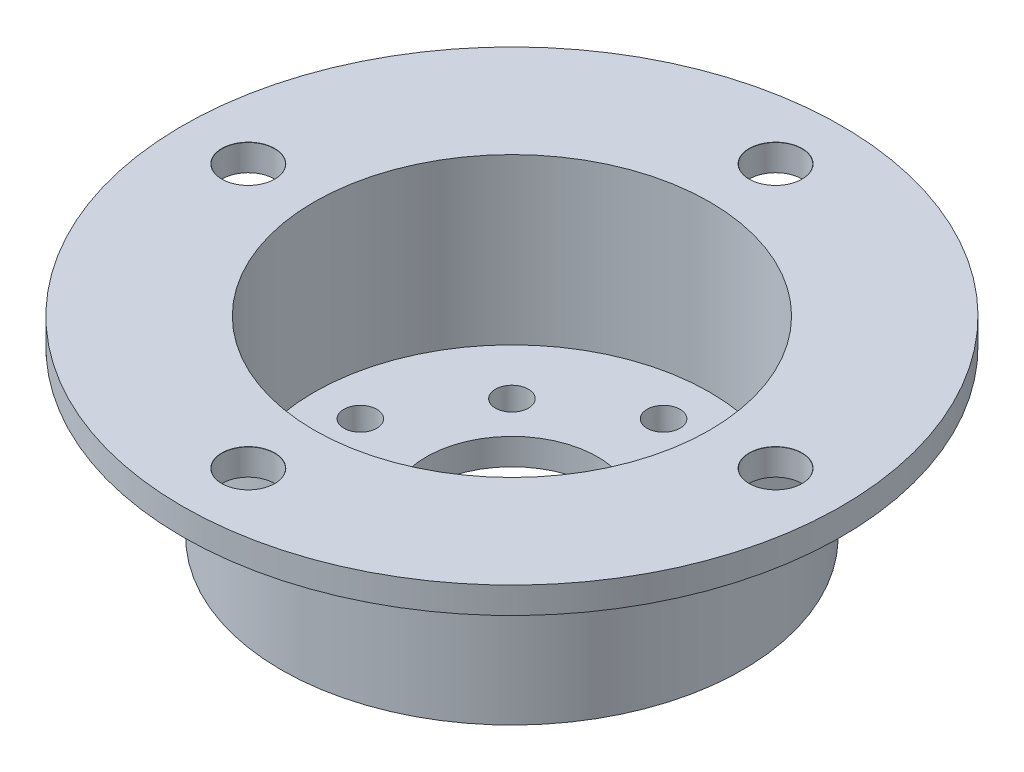
ISO-10303-21;
HEADER;
FILE_DESCRIPTION(('STEP AP214'),'2;1');
FILE_NAME('part.step','',(''),(''),'','','');
FILE_SCHEMA(('AUTOMOTIVE_DESIGN { 1 0 10303 214 1 1 1 1 }'));
ENDSEC;
DATA;
#1=APPLICATION_CONTEXT('core data for automotive mechanical design processes');
#2=APPLICATION_PROTOCOL_DEFINITION('international standard','automotive_design',2000,#1);
#3=PRODUCT_CONTEXT('',#1,'mechanical');
#4=PRODUCT('Part','Part','',(#3));
#5=PRODUCT_RELATED_PRODUCT_CATEGORY('part','',(#4));
#6=PRODUCT_DEFINITION_FORMATION('','',#4);
#7=PRODUCT_DEFINITION_CONTEXT('part definition',#1,'design');
#8=PRODUCT_DEFINITION('design','',#6,#7);
#9=PRODUCT_DEFINITION_SHAPE('','',#8);
#10=(LENGTH_UNIT() NAMED_UNIT(*) SI_UNIT(.MILLI.,.METRE.));
#11=(NAMED_UNIT(*) PLANE_ANGLE_UNIT() SI_UNIT($,.RADIAN.));
#12=(NAMED_UNIT(*) SI_UNIT($,.STERADIAN.) SOLID_ANGLE_UNIT());
#13=UNCERTAINTY_MEASURE_WITH_UNIT(LENGTH_MEASURE(1.E-05),#10,'distance_accuracy_value','');
#14=(GEOMETRIC_REPRESENTATION_CONTEXT(3) GLOBAL_UNCERTAINTY_ASSIGNED_CONTEXT((#13)) GLOBAL_UNIT_ASSIGNED_CONTEXT((#10,
#11,#12)) REPRESENTATION_CONTEXT('',''));
#15=CARTESIAN_POINT('',(0.,0.,0.));
#16=DIRECTION('',(0.,0.,1.));
#17=DIRECTION('',(1.,0.,0.));
#18=AXIS2_PLACEMENT_3D('',#15,#16,#17);
#19=CARTESIAN_POINT('',(0.,0.,0.));
#20=DIRECTION('',(0.,1.,0.));
#21=DIRECTION('',(0.,0.,1.));
#22=AXIS2_PLACEMENT_3D('',#19,#20,#21);
#23=PLANE('',#22);
#24=CARTESIAN_POINT('',(0.,0.,0.));
#25=DIRECTION('',(0.,1.,0.));
#26=DIRECTION('',(0.,0.,1.));
#27=AXIS2_PLACEMENT_3D('',#24,#25,#26);
#28=CIRCLE('',#27,13.);
#29=CARTESIAN_POINT('',(0.,0.,13.));
#30=VERTEX_POINT('',#29);
#31=EDGE_CURVE('E152',#30,#30,#28,.T.);
#32=ORIENTED_EDGE('',*,*,#31,.F.);
#33=EDGE_LOOP('',(#32));
#34=FACE_BOUND('',#33,.T.);
#35=CARTESIAN_POINT('',(-23.,0.,0.));
#36=DIRECTION('',(0.,1.,0.));
#37=DIRECTION('',(0.,0.,1.));
#38=AXIS2_PLACEMENT_3D('',#35,#36,#37);
#39=CIRCLE('',#38,2.5);
#40=CARTESIAN_POINT('',(-23.,0.,2.5));
#41=VERTEX_POINT('',#40);
#42=EDGE_CURVE('E149',#41,#41,#39,.T.);
#43=ORIENTED_EDGE('',*,*,#42,.F.);
#44=EDGE_LOOP('',(#43));
#45=FACE_BOUND('',#44,.T.);
#46=CARTESIAN_POINT('',(0.,0.,23.));
#47=DIRECTION('',(0.,1.,0.));
#48=DIRECTION('',(0.,0.,1.));
#49=AXIS2_PLACEMENT_3D('',#46,#47,#48);
#50=CIRCLE('',#49,2.5);
#51=CARTESIAN_POINT('',(0.,0.,25.5));
#52=VERTEX_POINT('',#51);
#53=EDGE_CURVE('E142',#52,#52,#50,.T.);
#54=ORIENTED_EDGE('',*,*,#53,.F.);
#55=EDGE_LOOP('',(#54));
#56=FACE_BOUND('',#55,.T.);
#57=CARTESIAN_POINT('',(0.,0.,-23.));
#58=DIRECTION('',(0.,1.,0.));
#59=DIRECTION('',(0.,0.,1.));
#60=AXIS2_PLACEMENT_3D('',#57,#58,#59);
#61=CIRCLE('',#60,2.5);
#62=CARTESIAN_POINT('',(0.,0.,-20.5));
#63=VERTEX_POINT('',#62);
#64=EDGE_CURVE('E135',#63,#63,#61,.T.);
#65=ORIENTED_EDGE('',*,*,#64,.F.);
#66=EDGE_LOOP('',(#65));
#67=FACE_BOUND('',#66,.T.);
#68=CARTESIAN_POINT('',(23.,0.,0.));
#69=DIRECTION('',(0.,1.,0.));
#70=DIRECTION('',(0.,0.,1.));
#71=AXIS2_PLACEMENT_3D('',#68,#69,#70);
#72=CIRCLE('',#71,2.5);
#73=CARTESIAN_POINT('',(23.,0.,2.5));
#74=VERTEX_POINT('',#73);
#75=EDGE_CURVE('E128',#74,#74,#72,.T.);
#76=ORIENTED_EDGE('',*,*,#75,.F.);
#77=EDGE_LOOP('',(#76));
#78=FACE_BOUND('',#77,.T.);
#79=CARTESIAN_POINT('',(14.142135623731,0.,14.1421356237309));
#80=DIRECTION('',(0.,1.,0.));
#81=DIRECTION('',(0.,0.,1.));
#82=AXIS2_PLACEMENT_3D('',#79,#80,#81);
#83=CIRCLE('',#82,2.49999999999999);
#84=CARTESIAN_POINT('',(14.142135623731,0.,16.6421356237309));
#85=VERTEX_POINT('',#84);
#86=EDGE_CURVE('E121',#85,#85,#83,.T.);
#87=ORIENTED_EDGE('',*,*,#86,.F.);
#88=EDGE_LOOP('',(#87));
#89=FACE_BOUND('',#88,.T.);
#90=CARTESIAN_POINT('',(-14.142135623731,0.,14.1421356237309));
#91=DIRECTION('',(0.,1.,0.));
#92=DIRECTION('',(0.,0.,1.));
#93=AXIS2_PLACEMENT_3D('',#90,#91,#92);
#94=CIRCLE('',#93,2.49999999999999);
#95=CARTESIAN_POINT('',(-14.142135623731,0.,16.6421356237309));
#96=VERTEX_POINT('',#95);
#97=EDGE_CURVE('E114',#96,#96,#94,.T.);
#98=ORIENTED_EDGE('',*,*,#97,.F.);
#99=EDGE_LOOP('',(#98));
#100=FACE_BOUND('',#99,.T.);
#101=CARTESIAN_POINT('',(14.142135623731,0.,-14.1421356237309));
#102=DIRECTION('',(0.,1.,0.));
#103=DIRECTION('',(0.,0.,1.));
#104=AXIS2_PLACEMENT_3D('',#101,#102,#103);
#105=CIRCLE('',#104,2.49999999999999);
#106=CARTESIAN_POINT('',(14.142135623731,0.,-11.6421356237309));
#107=VERTEX_POINT('',#106);
#108=EDGE_CURVE('E107',#107,#107,#105,.T.);
#109=ORIENTED_EDGE('',*,*,#108,.F.);
#110=EDGE_LOOP('',(#109));
#111=FACE_BOUND('',#110,.T.);
#112=CARTESIAN_POINT('',(-14.142135623731,0.,-14.1421356237309));
#113=DIRECTION('',(0.,1.,0.));
#114=DIRECTION('',(0.,0.,1.));
#115=AXIS2_PLACEMENT_3D('',#112,#113,#114);
#116=CIRCLE('',#115,2.49999999999999);
#117=CARTESIAN_POINT('',(-14.142135623731,0.,-11.6421356237309));
#118=VERTEX_POINT('',#117);
#119=EDGE_CURVE('E50',#118,#118,#116,.T.);
#120=ORIENTED_EDGE('',*,*,#119,.F.);
#121=EDGE_LOOP('',(#120));
#122=FACE_BOUND('',#121,.T.);
#123=CARTESIAN_POINT('',(0.,0.,0.));
#124=DIRECTION('',(0.,1.,0.));
#125=DIRECTION('',(0.,0.,1.));
#126=AXIS2_PLACEMENT_3D('',#123,#124,#125);
#127=CIRCLE('',#126,30.);
#128=CARTESIAN_POINT('',(0.,0.,-30.));
#129=VERTEX_POINT('',#128);
#130=EDGE_CURVE('E10',#129,#129,#127,.F.);
#131=ORIENTED_EDGE('',*,*,#130,.F.);
#132=EDGE_LOOP('',(#131));
#133=FACE_BOUND('',#132,.T.);
#134=ADVANCED_FACE('F33',(#34,#45,#56,#67,#78,#89,#100,#111,#122,#133),#23,.T.);
#135=CARTESIAN_POINT('',(0.,-4.,0.));
#136=DIRECTION('',(0.,1.,0.));
#137=DIRECTION('',(0.,0.,1.));
#138=AXIS2_PLACEMENT_3D('',#135,#136,#137);
#139=PLANE('',#138);
#140=CARTESIAN_POINT('',(14.142135623731,-4.,-14.1421356237309));
#141=DIRECTION('',(0.,-1.,0.));
#142=DIRECTION('',(0.,0.,-1.));
#143=AXIS2_PLACEMENT_3D('',#140,#141,#142);
#144=CIRCLE('',#143,2.525);
#145=CARTESIAN_POINT('',(14.142135623731,-4.,-16.6671356237309));
#146=VERTEX_POINT('',#145);
#147=EDGE_CURVE('E101',#146,#146,#144,.T.);
#148=ORIENTED_EDGE('',*,*,#147,.F.);
#149=EDGE_LOOP('',(#148));
#150=FACE_BOUND('',#149,.T.);
#151=CARTESIAN_POINT('',(-14.142135623731,-4.,14.1421356237309));
#152=DIRECTION('',(0.,-1.,0.));
#153=DIRECTION('',(0.,0.,-1.));
#154=AXIS2_PLACEMENT_3D('',#151,#152,#153);
#155=CIRCLE('',#154,2.525);
#156=CARTESIAN_POINT('',(-14.142135623731,-4.,11.6171356237309));
#157=VERTEX_POINT('',#156);
#158=EDGE_CURVE('E108',#157,#157,#155,.T.);
#159=ORIENTED_EDGE('',*,*,#158,.F.);
#160=EDGE_LOOP('',(#159));
#161=FACE_BOUND('',#160,.T.);
#162=CARTESIAN_POINT('',(14.142135623731,-4.,14.1421356237309));
#163=DIRECTION('',(0.,-1.,0.));
#164=DIRECTION('',(0.,0.,-1.));
#165=AXIS2_PLACEMENT_3D('',#162,#163,#164);
#166=CIRCLE('',#165,2.525);
#167=CARTESIAN_POINT('',(14.142135623731,-4.,11.6171356237309));
#168=VERTEX_POINT('',#167);
#169=EDGE_CURVE('E115',#168,#168,#166,.T.);
#170=ORIENTED_EDGE('',*,*,#169,.F.);
#171=EDGE_LOOP('',(#170));
#172=FACE_BOUND('',#171,.T.);
#173=CARTESIAN_POINT('',(23.,-4.,0.));
#174=DIRECTION('',(0.,-1.,0.));
#175=DIRECTION('',(0.,0.,-1.));
#176=AXIS2_PLACEMENT_3D('',#173,#174,#175);
#177=CIRCLE('',#176,2.525);
#178=CARTESIAN_POINT('',(23.,-4.,-2.525));
#179=VERTEX_POINT('',#178);
#180=EDGE_CURVE('E122',#179,#179,#177,.T.);
#181=ORIENTED_EDGE('',*,*,#180,.F.);
#182=EDGE_LOOP('',(#181));
#183=FACE_BOUND('',#182,.T.);
#184=CARTESIAN_POINT('',(0.,-4.,23.));
#185=DIRECTION('',(0.,-1.,0.));
#186=DIRECTION('',(0.,0.,-1.));
#187=AXIS2_PLACEMENT_3D('',#184,#185,#186);
#188=CIRCLE('',#187,2.525);
#189=CARTESIAN_POINT('',(0.,-4.,20.475));
#190=VERTEX_POINT('',#189);
#191=EDGE_CURVE('E136',#190,#190,#188,.T.);
#192=ORIENTED_EDGE('',*,*,#191,.F.);
#193=EDGE_LOOP('',(#192));
#194=FACE_BOUND('',#193,.T.);
#195=CARTESIAN_POINT('',(-23.,-4.,0.));
#196=DIRECTION('',(0.,-1.,0.));
#197=DIRECTION('',(0.,0.,-1.));
#198=AXIS2_PLACEMENT_3D('',#195,#196,#197);
#199=CIRCLE('',#198,2.525);
#200=CARTESIAN_POINT('',(-23.,-4.,-2.525));
#201=VERTEX_POINT('',#200);
#202=EDGE_CURVE('E143',#201,#201,#199,.T.);
#203=ORIENTED_EDGE('',*,*,#202,.F.);
#204=EDGE_LOOP('',(#203));
#205=FACE_BOUND('',#204,.T.);
#206=CARTESIAN_POINT('',(0.,-4.,0.));
#207=DIRECTION('',(0.,1.,0.));
#208=DIRECTION('',(0.,0.,1.));
#209=AXIS2_PLACEMENT_3D('',#206,#207,#208);
#210=CIRCLE('',#209,13.);
#211=CARTESIAN_POINT('',(0.,-4.,13.));
#212=VERTEX_POINT('',#211);
#213=EDGE_CURVE('E46',#212,#212,#210,.T.);
#214=ORIENTED_EDGE('',*,*,#213,.T.);
#215=EDGE_LOOP('',(#214));
#216=FACE_BOUND('',#215,.T.);
#217=CARTESIAN_POINT('',(0.,-4.,0.));
#218=DIRECTION('',(0.,1.,0.));
#219=DIRECTION('',(0.,0.,1.));
#220=AXIS2_PLACEMENT_3D('',#217,#218,#219);
#221=CIRCLE('',#220,35.);
#222=CARTESIAN_POINT('',(0.,-4.,35.));
#223=VERTEX_POINT('',#222);
#224=EDGE_CURVE('E41',#223,#223,#221,.T.);
#225=ORIENTED_EDGE('',*,*,#224,.F.);
#226=EDGE_LOOP('',(#225));
#227=FACE_BOUND('',#226,.T.);
#228=CARTESIAN_POINT('',(0.,-4.,-23.));
#229=DIRECTION('',(0.,-1.,0.));
#230=DIRECTION('',(0.,0.,-1.));
#231=AXIS2_PLACEMENT_3D('',#228,#229,#230);
#232=CIRCLE('',#231,2.525);
#233=CARTESIAN_POINT('',(0.,-4.,-25.525));
#234=VERTEX_POINT('',#233);
#235=EDGE_CURVE('E129',#234,#234,#232,.T.);
#236=ORIENTED_EDGE('',*,*,#235,.F.);
#237=EDGE_LOOP('',(#236));
#238=FACE_BOUND('',#237,.T.);
#239=CARTESIAN_POINT('',(-14.142135623731,-4.,-14.1421356237309));
#240=DIRECTION('',(0.,-1.,0.));
#241=DIRECTION('',(0.,0.,-1.));
#242=AXIS2_PLACEMENT_3D('',#239,#240,#241);
#243=CIRCLE('',#242,2.525);
#244=CARTESIAN_POINT('',(-14.142135623731,-4.,-16.6671356237309));
#245=VERTEX_POINT('',#244);
#246=EDGE_CURVE('E95',#245,#245,#243,.T.);
#247=ORIENTED_EDGE('',*,*,#246,.F.);
#248=EDGE_LOOP('',(#247));
#249=FACE_BOUND('',#248,.T.);
#250=ADVANCED_FACE('F174',(#150,#161,#172,#183,#194,#205,#216,#227,#238,#249),#139,.F.);
#251=CARTESIAN_POINT('',(0.,-4.,0.));
#252=DIRECTION('',(0.,1.,0.));
#253=DIRECTION('',(0.,0.,1.));
#254=AXIS2_PLACEMENT_3D('',#251,#252,#253);
#255=CYLINDRICAL_SURFACE('',#254,35.);
#256=ORIENTED_EDGE('',*,*,#224,.T.);
#257=EDGE_LOOP('',(#256));
#258=FACE_BOUND('',#257,.T.);
#259=CARTESIAN_POINT('',(0.,21.,0.));
#260=DIRECTION('',(0.,1.,0.));
#261=DIRECTION('',(0.,0.,1.));
#262=AXIS2_PLACEMENT_3D('',#259,#260,#261);
#263=CIRCLE('',#262,35.);
#264=CARTESIAN_POINT('',(0.,21.,35.));
#265=VERTEX_POINT('',#264);
#266=EDGE_CURVE('E90',#265,#265,#263,.T.);
#267=ORIENTED_EDGE('',*,*,#266,.F.);
#268=EDGE_LOOP('',(#267));
#269=FACE_BOUND('',#268,.T.);
#270=ADVANCED_FACE('F35',(#258,#269),#255,.T.);
#271=CARTESIAN_POINT('',(0.,-4.,0.));
#272=DIRECTION('',(0.,1.,0.));
#273=DIRECTION('',(0.,0.,1.));
#274=AXIS2_PLACEMENT_3D('',#271,#272,#273);
#275=CYLINDRICAL_SURFACE('',#274,13.);
#276=ORIENTED_EDGE('',*,*,#213,.F.);
#277=EDGE_LOOP('',(#276));
#278=FACE_BOUND('',#277,.T.);
#279=ORIENTED_EDGE('',*,*,#31,.T.);
#280=EDGE_LOOP('',(#279));
#281=FACE_BOUND('',#280,.T.);
#282=ADVANCED_FACE('F200',(#278,#281),#275,.F.);
#283=CARTESIAN_POINT('',(-23.,-4.,0.));
#284=DIRECTION('',(0.,-1.,0.));
#285=DIRECTION('',(0.,0.,-1.));
#286=AXIS2_PLACEMENT_3D('',#283,#284,#285);
#287=CYLINDRICAL_SURFACE('',#286,2.5);
#288=ORIENTED_EDGE('',*,*,#42,.T.);
#289=EDGE_LOOP('',(#288));
#290=FACE_BOUND('',#289,.T.);
#291=CARTESIAN_POINT('',(-23.,-3.975,0.));
#292=DIRECTION('',(0.,-1.,0.));
#293=DIRECTION('',(0.,0.,-1.));
#294=AXIS2_PLACEMENT_3D('',#291,#292,#293);
#295=CIRCLE('',#294,2.5);
#296=CARTESIAN_POINT('',(-23.,-3.975,-2.5));
#297=VERTEX_POINT('',#296);
#298=EDGE_CURVE('E146',#297,#297,#295,.T.);
#299=ORIENTED_EDGE('',*,*,#298,.T.);
#300=EDGE_LOOP('',(#299));
#301=FACE_BOUND('',#300,.T.);
#302=ADVANCED_FACE('F207',(#290,#301),#287,.F.);
#303=CARTESIAN_POINT('',(-23.,-4.,0.));
#304=DIRECTION('',(0.,-1.,0.));
#305=DIRECTION('',(0.,0.,-1.));
#306=AXIS2_PLACEMENT_3D('',#303,#304,#305);
#307=CONICAL_SURFACE('',#306,2.525,0.785398163397448);
#308=ORIENTED_EDGE('',*,*,#298,.F.);
#309=EDGE_LOOP('',(#308));
#310=FACE_BOUND('',#309,.T.);
#311=ORIENTED_EDGE('',*,*,#202,.T.);
#312=EDGE_LOOP('',(#311));
#313=FACE_BOUND('',#312,.T.);
#314=ADVANCED_FACE('F211',(#310,#313),#307,.F.);
#315=CARTESIAN_POINT('',(0.,-4.,23.));
#316=DIRECTION('',(0.,-1.,0.));
#317=DIRECTION('',(0.,0.,-1.));
#318=AXIS2_PLACEMENT_3D('',#315,#316,#317);
#319=CYLINDRICAL_SURFACE('',#318,2.5);
#320=ORIENTED_EDGE('',*,*,#53,.T.);
#321=EDGE_LOOP('',(#320));
#322=FACE_BOUND('',#321,.T.);
#323=CARTESIAN_POINT('',(0.,-3.975,23.));
#324=DIRECTION('',(0.,-1.,0.));
#325=DIRECTION('',(0.,0.,-1.));
#326=AXIS2_PLACEMENT_3D('',#323,#324,#325);
#327=CIRCLE('',#326,2.5);
#328=CARTESIAN_POINT('',(0.,-3.975,20.5));
#329=VERTEX_POINT('',#328);
#330=EDGE_CURVE('E139',#329,#329,#327,.T.);
#331=ORIENTED_EDGE('',*,*,#330,.T.);
#332=EDGE_LOOP('',(#331));
#333=FACE_BOUND('',#332,.T.);
#334=ADVANCED_FACE('F215',(#322,#333),#319,.F.);
#335=CARTESIAN_POINT('',(0.,-4.,23.));
#336=DIRECTION('',(0.,-1.,0.));
#337=DIRECTION('',(0.,0.,-1.));
#338=AXIS2_PLACEMENT_3D('',#335,#336,#337);
#339=CONICAL_SURFACE('',#338,2.525,0.785398163397474);
#340=ORIENTED_EDGE('',*,*,#330,.F.);
#341=EDGE_LOOP('',(#340));
#342=FACE_BOUND('',#341,.T.);
#343=ORIENTED_EDGE('',*,*,#191,.T.);
#344=EDGE_LOOP('',(#343));
#345=FACE_BOUND('',#344,.T.);
#346=ADVANCED_FACE('F219',(#342,#345),#339,.F.);
#347=CARTESIAN_POINT('',(0.,-4.,-23.));
#348=DIRECTION('',(0.,-1.,0.));
#349=DIRECTION('',(0.,0.,-1.));
#350=AXIS2_PLACEMENT_3D('',#347,#348,#349);
#351=CYLINDRICAL_SURFACE('',#350,2.5);
#352=ORIENTED_EDGE('',*,*,#64,.T.);
#353=EDGE_LOOP('',(#352));
#354=FACE_BOUND('',#353,.T.);
#355=CARTESIAN_POINT('',(0.,-3.975,-23.));
#356=DIRECTION('',(0.,-1.,0.));
#357=DIRECTION('',(0.,0.,-1.));
#358=AXIS2_PLACEMENT_3D('',#355,#356,#357);
#359=CIRCLE('',#358,2.5);
#360=CARTESIAN_POINT('',(0.,-3.975,-25.5));
#361=VERTEX_POINT('',#360);
#362=EDGE_CURVE('E132',#361,#361,#359,.T.);
#363=ORIENTED_EDGE('',*,*,#362,.T.);
#364=EDGE_LOOP('',(#363));
#365=FACE_BOUND('',#364,.T.);
#366=ADVANCED_FACE('F223',(#354,#365),#351,.F.);
#367=CARTESIAN_POINT('',(0.,-4.,-23.));
#368=DIRECTION('',(0.,-1.,0.));
#369=DIRECTION('',(0.,0.,-1.));
#370=AXIS2_PLACEMENT_3D('',#367,#368,#369);
#371=CONICAL_SURFACE('',#370,2.525,0.785398163397474);
#372=ORIENTED_EDGE('',*,*,#362,.F.);
#373=EDGE_LOOP('',(#372));
#374=FACE_BOUND('',#373,.T.);
#375=ORIENTED_EDGE('',*,*,#235,.T.);
#376=EDGE_LOOP('',(#375));
#377=FACE_BOUND('',#376,.T.);
#378=ADVANCED_FACE('F227',(#374,#377),#371,.F.);
#379=CARTESIAN_POINT('',(23.,-4.,0.));
#380=DIRECTION('',(0.,-1.,0.));
#381=DIRECTION('',(0.,0.,-1.));
#382=AXIS2_PLACEMENT_3D('',#379,#380,#381);
#383=CYLINDRICAL_SURFACE('',#382,2.5);
#384=ORIENTED_EDGE('',*,*,#75,.T.);
#385=EDGE_LOOP('',(#384));
#386=FACE_BOUND('',#385,.T.);
#387=CARTESIAN_POINT('',(23.,-3.975,0.));
#388=DIRECTION('',(0.,-1.,0.));
#389=DIRECTION('',(0.,0.,-1.));
#390=AXIS2_PLACEMENT_3D('',#387,#388,#389);
#391=CIRCLE('',#390,2.5);
#392=CARTESIAN_POINT('',(23.,-3.975,-2.5));
#393=VERTEX_POINT('',#392);
#394=EDGE_CURVE('E125',#393,#393,#391,.T.);
#395=ORIENTED_EDGE('',*,*,#394,.T.);
#396=EDGE_LOOP('',(#395));
#397=FACE_BOUND('',#396,.T.);
#398=ADVANCED_FACE('F231',(#386,#397),#383,.F.);
#399=CARTESIAN_POINT('',(23.,-4.,0.));
#400=DIRECTION('',(0.,-1.,0.));
#401=DIRECTION('',(0.,0.,-1.));
#402=AXIS2_PLACEMENT_3D('',#399,#400,#401);
#403=CONICAL_SURFACE('',#402,2.525,0.785398163397448);
#404=ORIENTED_EDGE('',*,*,#394,.F.);
#405=EDGE_LOOP('',(#404));
#406=FACE_BOUND('',#405,.T.);
#407=ORIENTED_EDGE('',*,*,#180,.T.);
#408=EDGE_LOOP('',(#407));
#409=FACE_BOUND('',#408,.T.);
#410=ADVANCED_FACE('F235',(#406,#409),#403,.F.);
#411=CARTESIAN_POINT('',(14.142135623731,-4.,14.1421356237309));
#412=DIRECTION('',(0.,-1.,0.));
#413=DIRECTION('',(0.,0.,-1.));
#414=AXIS2_PLACEMENT_3D('',#411,#412,#413);
#415=CYLINDRICAL_SURFACE('',#414,2.49999999999999);
#416=ORIENTED_EDGE('',*,*,#86,.T.);
#417=EDGE_LOOP('',(#416));
#418=FACE_BOUND('',#417,.T.);
#419=CARTESIAN_POINT('',(14.142135623731,-3.97499999999999,14.1421356237309));
#420=DIRECTION('',(0.,-1.,0.));
#421=DIRECTION('',(0.,0.,-1.));
#422=AXIS2_PLACEMENT_3D('',#419,#420,#421);
#423=CIRCLE('',#422,2.49999999999999);
#424=CARTESIAN_POINT('',(14.142135623731,-3.97499999999999,11.6421356237309));
#425=VERTEX_POINT('',#424);
#426=EDGE_CURVE('E118',#425,#425,#423,.T.);
#427=ORIENTED_EDGE('',*,*,#426,.T.);
#428=EDGE_LOOP('',(#427));
#429=FACE_BOUND('',#428,.T.);
#430=ADVANCED_FACE('F239',(#418,#429),#415,.F.);
#431=CARTESIAN_POINT('',(14.142135623731,-4.,14.1421356237309));
#432=DIRECTION('',(0.,-1.,0.));
#433=DIRECTION('',(0.,0.,-1.));
#434=AXIS2_PLACEMENT_3D('',#431,#432,#433);
#435=CONICAL_SURFACE('',#434,2.525,0.785398163397344);
#436=ORIENTED_EDGE('',*,*,#426,.F.);
#437=EDGE_LOOP('',(#436));
#438=FACE_BOUND('',#437,.T.);
#439=ORIENTED_EDGE('',*,*,#169,.T.);
#440=EDGE_LOOP('',(#439));
#441=FACE_BOUND('',#440,.T.);
#442=ADVANCED_FACE('F243',(#438,#441),#435,.F.);
#443=CARTESIAN_POINT('',(-14.142135623731,-4.,14.1421356237309));
#444=DIRECTION('',(0.,-1.,0.));
#445=DIRECTION('',(0.,0.,-1.));
#446=AXIS2_PLACEMENT_3D('',#443,#444,#445);
#447=CYLINDRICAL_SURFACE('',#446,2.49999999999999);
#448=ORIENTED_EDGE('',*,*,#97,.T.);
#449=EDGE_LOOP('',(#448));
#450=FACE_BOUND('',#449,.T.);
#451=CARTESIAN_POINT('',(-14.142135623731,-3.97499999999999,14.1421356237309));
#452=DIRECTION('',(0.,-1.,0.));
#453=DIRECTION('',(0.,0.,-1.));
#454=AXIS2_PLACEMENT_3D('',#451,#452,#453);
#455=CIRCLE('',#454,2.49999999999999);
#456=CARTESIAN_POINT('',(-14.142135623731,-3.97499999999999,11.6421356237309));
#457=VERTEX_POINT('',#456);
#458=EDGE_CURVE('E111',#457,#457,#455,.T.);
#459=ORIENTED_EDGE('',*,*,#458,.T.);
#460=EDGE_LOOP('',(#459));
#461=FACE_BOUND('',#460,.T.);
#462=ADVANCED_FACE('F247',(#450,#461),#447,.F.);
#463=CARTESIAN_POINT('',(-14.142135623731,-4.,14.1421356237309));
#464=DIRECTION('',(0.,-1.,0.));
#465=DIRECTION('',(0.,0.,-1.));
#466=AXIS2_PLACEMENT_3D('',#463,#464,#465);
#467=CONICAL_SURFACE('',#466,2.525,0.785398163397379);
#468=ORIENTED_EDGE('',*,*,#458,.F.);
#469=EDGE_LOOP('',(#468));
#470=FACE_BOUND('',#469,.T.);
#471=ORIENTED_EDGE('',*,*,#158,.T.);
#472=EDGE_LOOP('',(#471));
#473=FACE_BOUND('',#472,.T.);
#474=ADVANCED_FACE('F251',(#470,#473),#467,.F.);
#475=CARTESIAN_POINT('',(14.142135623731,-4.,-14.1421356237309));
#476=DIRECTION('',(0.,-1.,0.));
#477=DIRECTION('',(0.,0.,-1.));
#478=AXIS2_PLACEMENT_3D('',#475,#476,#477);
#479=CYLINDRICAL_SURFACE('',#478,2.49999999999999);
#480=ORIENTED_EDGE('',*,*,#108,.T.);
#481=EDGE_LOOP('',(#480));
#482=FACE_BOUND('',#481,.T.);
#483=CARTESIAN_POINT('',(14.142135623731,-3.97499999999999,-14.1421356237309));
#484=DIRECTION('',(0.,-1.,0.));
#485=DIRECTION('',(0.,0.,-1.));
#486=AXIS2_PLACEMENT_3D('',#483,#484,#485);
#487=CIRCLE('',#486,2.49999999999999);
#488=CARTESIAN_POINT('',(14.142135623731,-3.97499999999999,-16.6421356237309));
#489=VERTEX_POINT('',#488);
#490=EDGE_CURVE('E104',#489,#489,#487,.T.);
#491=ORIENTED_EDGE('',*,*,#490,.T.);
#492=EDGE_LOOP('',(#491));
#493=FACE_BOUND('',#492,.T.);
#494=ADVANCED_FACE('F169',(#482,#493),#479,.F.);
#495=CARTESIAN_POINT('',(14.142135623731,-4.,-14.1421356237309));
#496=DIRECTION('',(0.,-1.,0.));
#497=DIRECTION('',(0.,0.,-1.));
#498=AXIS2_PLACEMENT_3D('',#495,#496,#497);
#499=CONICAL_SURFACE('',#498,2.525,0.785398163397344);
#500=ORIENTED_EDGE('',*,*,#490,.F.);
#501=EDGE_LOOP('',(#500));
#502=FACE_BOUND('',#501,.T.);
#503=ORIENTED_EDGE('',*,*,#147,.T.);
#504=EDGE_LOOP('',(#503));
#505=FACE_BOUND('',#504,.T.);
#506=ADVANCED_FACE('F184',(#502,#505),#499,.F.);
#507=CARTESIAN_POINT('',(-14.142135623731,-4.,-14.1421356237309));
#508=DIRECTION('',(0.,-1.,0.));
#509=DIRECTION('',(0.,0.,-1.));
#510=AXIS2_PLACEMENT_3D('',#507,#508,#509);
#511=CYLINDRICAL_SURFACE('',#510,2.49999999999999);
#512=ORIENTED_EDGE('',*,*,#119,.T.);
#513=EDGE_LOOP('',(#512));
#514=FACE_BOUND('',#513,.T.);
#515=CARTESIAN_POINT('',(-14.142135623731,-3.97499999999999,-14.1421356237309));
#516=DIRECTION('',(0.,-1.,0.));
#517=DIRECTION('',(0.,0.,-1.));
#518=AXIS2_PLACEMENT_3D('',#515,#516,#517);
#519=CIRCLE('',#518,2.49999999999999);
#520=CARTESIAN_POINT('',(-14.142135623731,-3.97499999999999,-16.6421356237309));
#521=VERTEX_POINT('',#520);
#522=EDGE_CURVE('E98',#521,#521,#519,.T.);
#523=ORIENTED_EDGE('',*,*,#522,.T.);
#524=EDGE_LOOP('',(#523));
#525=FACE_BOUND('',#524,.T.);
#526=ADVANCED_FACE('F180',(#514,#525),#511,.F.);
#527=CARTESIAN_POINT('',(-14.142135623731,-4.,-14.1421356237309));
#528=DIRECTION('',(0.,-1.,0.));
#529=DIRECTION('',(0.,0.,-1.));
#530=AXIS2_PLACEMENT_3D('',#527,#528,#529);
#531=CONICAL_SURFACE('',#530,2.525,0.785398163397379);
#532=ORIENTED_EDGE('',*,*,#522,.F.);
#533=EDGE_LOOP('',(#532));
#534=FACE_BOUND('',#533,.T.);
#535=ORIENTED_EDGE('',*,*,#246,.T.);
#536=EDGE_LOOP('',(#535));
#537=FACE_BOUND('',#536,.T.);
#538=ADVANCED_FACE('F183',(#534,#537),#531,.F.);
#539=CARTESIAN_POINT('',(0.,21.,0.));
#540=DIRECTION('',(0.,-1.,0.));
#541=DIRECTION('',(0.,0.,-1.));
#542=AXIS2_PLACEMENT_3D('',#539,#540,#541);
#543=CYLINDRICAL_SURFACE('',#542,30.);
#544=CARTESIAN_POINT('',(0.,25.,0.));
#545=DIRECTION('',(0.,1.,0.));
#546=DIRECTION('',(0.,0.,1.));
#547=AXIS2_PLACEMENT_3D('',#544,#545,#546);
#548=CIRCLE('',#547,30.);
#549=CARTESIAN_POINT('',(0.,25.,-30.));
#550=VERTEX_POINT('',#549);
#551=EDGE_CURVE('E55',#550,#550,#548,.T.);
#552=CARTESIAN_POINT('',(0.,0.,-30.));
#553=CARTESIAN_POINT('',(0.,0.260416666666667,-30.));
#554=CARTESIAN_POINT('',(0.,0.520833333333334,-30.));
#555=CARTESIAN_POINT('',(0.,1.04166666666667,-30.));
#556=CARTESIAN_POINT('',(0.,1.30208333333333,-30.));
#557=CARTESIAN_POINT('',(0.,1.82291666666667,-30.));
#558=CARTESIAN_POINT('',(0.,2.08333333333333,-30.));
#559=CARTESIAN_POINT('',(0.,2.60416666666667,-30.));
#560=CARTESIAN_POINT('',(0.,2.86458333333333,-30.));
#561=CARTESIAN_POINT('',(0.,3.38541666666667,-30.));
#562=CARTESIAN_POINT('',(0.,3.64583333333333,-30.));
#563=CARTESIAN_POINT('',(0.,4.16666666666667,-30.));
#564=CARTESIAN_POINT('',(0.,4.42708333333333,-30.));
#565=CARTESIAN_POINT('',(0.,4.94791666666667,-30.));
#566=CARTESIAN_POINT('',(0.,5.20833333333333,-30.));
#567=CARTESIAN_POINT('',(0.,5.72916666666667,-30.));
#568=CARTESIAN_POINT('',(0.,5.98958333333333,-30.));
#569=CARTESIAN_POINT('',(0.,6.51041666666667,-30.));
#570=CARTESIAN_POINT('',(0.,6.77083333333333,-30.));
#571=CARTESIAN_POINT('',(0.,7.29166666666666,-30.));
#572=CARTESIAN_POINT('',(0.,7.55208333333333,-30.));
#573=CARTESIAN_POINT('',(0.,8.07291666666667,-30.));
#574=CARTESIAN_POINT('',(0.,8.33333333333333,-30.));
#575=CARTESIAN_POINT('',(0.,8.85416666666667,-30.));
#576=CARTESIAN_POINT('',(0.,9.11458333333333,-30.));
#577=CARTESIAN_POINT('',(0.,9.63541666666667,-30.));
#578=CARTESIAN_POINT('',(0.,9.89583333333333,-30.));
#579=CARTESIAN_POINT('',(0.,10.4166666666667,-30.));
#580=CARTESIAN_POINT('',(0.,10.6770833333333,-30.));
#581=CARTESIAN_POINT('',(0.,11.1979166666667,-30.));
#582=CARTESIAN_POINT('',(0.,11.4583333333333,-30.));
#583=CARTESIAN_POINT('',(0.,11.9791666666667,-30.));
#584=CARTESIAN_POINT('',(0.,12.2395833333333,-30.));
#585=CARTESIAN_POINT('',(0.,12.7604166666667,-30.));
#586=CARTESIAN_POINT('',(0.,13.0208333333333,-30.));
#587=CARTESIAN_POINT('',(0.,13.5416666666667,-30.));
#588=CARTESIAN_POINT('',(0.,13.8020833333333,-30.));
#589=CARTESIAN_POINT('',(0.,14.3229166666667,-30.));
#590=CARTESIAN_POINT('',(0.,14.5833333333333,-30.));
#591=CARTESIAN_POINT('',(0.,15.1041666666667,-30.));
#592=CARTESIAN_POINT('',(0.,15.3645833333333,-30.));
#593=CARTESIAN_POINT('',(0.,15.8854166666667,-30.));
#594=CARTESIAN_POINT('',(0.,16.1458333333333,-30.));
#595=CARTESIAN_POINT('',(0.,16.6666666666667,-30.));
#596=CARTESIAN_POINT('',(0.,16.9270833333333,-30.));
#597=CARTESIAN_POINT('',(0.,17.4479166666667,-30.));
#598=CARTESIAN_POINT('',(0.,17.7083333333333,-30.));
#599=CARTESIAN_POINT('',(0.,18.2291666666667,-30.));
#600=CARTESIAN_POINT('',(0.,18.4895833333333,-30.));
#601=CARTESIAN_POINT('',(0.,19.0104166666667,-30.));
#602=CARTESIAN_POINT('',(0.,19.2708333333333,-30.));
#603=CARTESIAN_POINT('',(0.,19.7916666666667,-30.));
#604=CARTESIAN_POINT('',(0.,20.0520833333333,-30.));
#605=CARTESIAN_POINT('',(0.,20.5729166666667,-30.));
#606=CARTESIAN_POINT('',(0.,20.8333333333333,-30.));
#607=CARTESIAN_POINT('',(0.,21.3541666666667,-30.));
#608=CARTESIAN_POINT('',(0.,21.6145833333333,-30.));
#609=CARTESIAN_POINT('',(0.,22.1354166666667,-30.));
#610=CARTESIAN_POINT('',(0.,22.3958333333333,-30.));
#611=CARTESIAN_POINT('',(0.,22.9166666666667,-30.));
#612=CARTESIAN_POINT('',(0.,23.1770833333333,-30.));
#613=CARTESIAN_POINT('',(0.,23.6979166666667,-30.));
#614=CARTESIAN_POINT('',(0.,23.9583333333333,-30.));
#615=CARTESIAN_POINT('',(0.,24.4791666666667,-30.));
#616=CARTESIAN_POINT('',(0.,24.7395833333333,-30.));
#617=CARTESIAN_POINT('',(0.,25.,-30.));
#618=B_SPLINE_CURVE_WITH_KNOTS('',3,(#552,#553,#554,#555,#556,#557,#558,#559,#560,#561,#562,
#563,#564,#565,#566,#567,#568,#569,#570,#571,#572,#573,#574,#575,#576,#577,#578,#579,#580,#581,
#582,#583,#584,#585,#586,#587,#588,#589,#590,#591,#592,#593,#594,#595,#596,#597,#598,#599,#600,
#601,#602,#603,#604,#605,#606,#607,#608,#609,#610,#611,#612,#613,#614,#615,#616,#617),
.UNSPECIFIED.,.F.,.F.,(4,2,2,2,2,2,2,2,2,2,2,2,2,2,2,2,2,2,2,2,2,2,2,2,2,2,2,2,2,2,2,2,4),(0.,
0.781250000000001,1.5625,2.34375,3.125,3.90625,4.6875,5.46875,6.25,7.03125,7.8125,8.59375,9.375,
10.15625,10.9375,11.71875,12.5,13.28125,14.0625,14.84375,15.625,16.40625,17.1875,17.96875,18.75,
19.53125,20.3125,21.09375,21.875,22.65625,23.4375,24.21875,25.),.UNSPECIFIED.);
#619=EDGE_CURVE('BSEAM190',#129,#550,#618,.T.);
#620=ORIENTED_EDGE('',*,*,#130,.T.);
#621=ORIENTED_EDGE('',*,*,#551,.T.);
#622=ORIENTED_EDGE('',*,*,#619,.T.);
#623=ORIENTED_EDGE('',*,*,#619,.F.);
#624=EDGE_LOOP('',(#620,#622,#621,#623));
#625=FACE_BOUND('',#624,.T.);
#626=ADVANCED_FACE('F190',(#625),#543,.F.);
#627=CARTESIAN_POINT('',(0.,25.,0.));
#628=DIRECTION('',(0.,1.,0.));
#629=DIRECTION('',(0.,0.,1.));
#630=AXIS2_PLACEMENT_3D('',#627,#628,#629);
#631=PLANE('',#630);
#632=CARTESIAN_POINT('',(40.,25.,0.));
#633=DIRECTION('',(0.,1.,0.));
#634=DIRECTION('',(0.,0.,1.));
#635=AXIS2_PLACEMENT_3D('',#632,#633,#634);
#636=CIRCLE('',#635,4.025);
#637=CARTESIAN_POINT('',(40.,25.,4.025));
#638=VERTEX_POINT('',#637);
#639=EDGE_CURVE('E313',#638,#638,#636,.T.);
#640=ORIENTED_EDGE('',*,*,#639,.F.);
#641=EDGE_LOOP('',(#640));
#642=FACE_BOUND('',#641,.T.);
#643=CARTESIAN_POINT('',(0.,25.,40.));
#644=DIRECTION('',(0.,1.,0.));
#645=DIRECTION('',(0.,0.,1.));
#646=AXIS2_PLACEMENT_3D('',#643,#644,#645);
#647=CIRCLE('',#646,4.025);
#648=CARTESIAN_POINT('',(0.,25.,44.025));
#649=VERTEX_POINT('',#648);
#650=EDGE_CURVE('E70',#649,#649,#647,.T.);
#651=ORIENTED_EDGE('',*,*,#650,.F.);
#652=EDGE_LOOP('',(#651));
#653=FACE_BOUND('',#652,.T.);
#654=CARTESIAN_POINT('',(0.,25.,-40.));
#655=DIRECTION('',(0.,1.,0.));
#656=DIRECTION('',(0.,0.,1.));
#657=AXIS2_PLACEMENT_3D('',#654,#655,#656);
#658=CIRCLE('',#657,4.025);
#659=CARTESIAN_POINT('',(0.,25.,-35.975));
#660=VERTEX_POINT('',#659);
#661=EDGE_CURVE('E63',#660,#660,#658,.T.);
#662=ORIENTED_EDGE('',*,*,#661,.F.);
#663=EDGE_LOOP('',(#662));
#664=FACE_BOUND('',#663,.T.);
#665=CARTESIAN_POINT('',(-40.,25.,0.));
#666=DIRECTION('',(0.,1.,0.));
#667=DIRECTION('',(0.,0.,1.));
#668=AXIS2_PLACEMENT_3D('',#665,#666,#667);
#669=CIRCLE('',#668,4.025);
#670=CARTESIAN_POINT('',(-40.,25.,4.025));
#671=VERTEX_POINT('',#670);
#672=EDGE_CURVE('E59',#671,#671,#669,.T.);
#673=ORIENTED_EDGE('',*,*,#672,.F.);
#674=EDGE_LOOP('',(#673));
#675=FACE_BOUND('',#674,.T.);
#676=CARTESIAN_POINT('',(0.,25.,0.));
#677=DIRECTION('',(0.,1.,0.));
#678=DIRECTION('',(0.,0.,1.));
#679=AXIS2_PLACEMENT_3D('',#676,#677,#678);
#680=CIRCLE('',#679,50.);
#681=CARTESIAN_POINT('',(0.,25.,50.));
#682=VERTEX_POINT('',#681);
#683=EDGE_CURVE('E87',#682,#682,#680,.T.);
#684=ORIENTED_EDGE('',*,*,#683,.T.);
#685=EDGE_LOOP('',(#684));
#686=FACE_BOUND('',#685,.T.);
#687=ORIENTED_EDGE('',*,*,#551,.F.);
#688=EDGE_LOOP('',(#687));
#689=FACE_BOUND('',#688,.T.);
#690=ADVANCED_FACE('F263',(#642,#653,#664,#675,#686,#689),#631,.T.);
#691=CARTESIAN_POINT('',(0.,21.,0.));
#692=DIRECTION('',(0.,1.,0.));
#693=DIRECTION('',(0.,0.,1.));
#694=AXIS2_PLACEMENT_3D('',#691,#692,#693);
#695=PLANE('',#694);
#696=CARTESIAN_POINT('',(40.,21.,0.));
#697=DIRECTION('',(0.,1.,0.));
#698=DIRECTION('',(0.,0.,1.));
#699=AXIS2_PLACEMENT_3D('',#696,#697,#698);
#700=CIRCLE('',#699,4.);
#701=CARTESIAN_POINT('',(40.,21.,4.));
#702=VERTEX_POINT('',#701);
#703=EDGE_CURVE('E37',#702,#702,#700,.T.);
#704=ORIENTED_EDGE('',*,*,#703,.T.);
#705=EDGE_LOOP('',(#704));
#706=FACE_BOUND('',#705,.T.);
#707=CARTESIAN_POINT('',(0.,21.,40.));
#708=DIRECTION('',(0.,1.,0.));
#709=DIRECTION('',(0.,0.,1.));
#710=AXIS2_PLACEMENT_3D('',#707,#708,#709);
#711=CIRCLE('',#710,4.);
#712=CARTESIAN_POINT('',(0.,21.,44.));
#713=VERTEX_POINT('',#712);
#714=EDGE_CURVE('E61',#713,#713,#711,.T.);
#715=ORIENTED_EDGE('',*,*,#714,.T.);
#716=EDGE_LOOP('',(#715));
#717=FACE_BOUND('',#716,.T.);
#718=CARTESIAN_POINT('',(0.,21.,-40.));
#719=DIRECTION('',(0.,1.,0.));
#720=DIRECTION('',(0.,0.,1.));
#721=AXIS2_PLACEMENT_3D('',#718,#719,#720);
#722=CIRCLE('',#721,4.);
#723=CARTESIAN_POINT('',(0.,21.,-36.));
#724=VERTEX_POINT('',#723);
#725=EDGE_CURVE('E57',#724,#724,#722,.T.);
#726=ORIENTED_EDGE('',*,*,#725,.T.);
#727=EDGE_LOOP('',(#726));
#728=FACE_BOUND('',#727,.T.);
#729=CARTESIAN_POINT('',(-40.,21.,0.));
#730=DIRECTION('',(0.,1.,0.));
#731=DIRECTION('',(0.,0.,1.));
#732=AXIS2_PLACEMENT_3D('',#729,#730,#731);
#733=CIRCLE('',#732,4.);
#734=CARTESIAN_POINT('',(-40.,21.,4.));
#735=VERTEX_POINT('',#734);
#736=EDGE_CURVE('E52',#735,#735,#733,.T.);
#737=ORIENTED_EDGE('',*,*,#736,.T.);
#738=EDGE_LOOP('',(#737));
#739=FACE_BOUND('',#738,.T.);
#740=ORIENTED_EDGE('',*,*,#266,.T.);
#741=EDGE_LOOP('',(#740));
#742=FACE_BOUND('',#741,.T.);
#743=CARTESIAN_POINT('',(0.,21.,0.));
#744=DIRECTION('',(0.,1.,0.));
#745=DIRECTION('',(0.,0.,1.));
#746=AXIS2_PLACEMENT_3D('',#743,#744,#745);
#747=CIRCLE('',#746,50.);
#748=CARTESIAN_POINT('',(0.,21.,50.));
#749=VERTEX_POINT('',#748);
#750=EDGE_CURVE('E86',#749,#749,#747,.T.);
#751=ORIENTED_EDGE('',*,*,#750,.F.);
#752=EDGE_LOOP('',(#751));
#753=FACE_BOUND('',#752,.T.);
#754=ADVANCED_FACE('F268',(#706,#717,#728,#739,#742,#753),#695,.F.);
#755=CARTESIAN_POINT('',(0.,25.,0.));
#756=DIRECTION('',(0.,-1.,0.));
#757=DIRECTION('',(0.,0.,-1.));
#758=AXIS2_PLACEMENT_3D('',#755,#756,#757);
#759=CYLINDRICAL_SURFACE('',#758,50.);
#760=ORIENTED_EDGE('',*,*,#683,.F.);
#761=EDGE_LOOP('',(#760));
#762=FACE_BOUND('',#761,.T.);
#763=ORIENTED_EDGE('',*,*,#750,.T.);
#764=EDGE_LOOP('',(#763));
#765=FACE_BOUND('',#764,.T.);
#766=ADVANCED_FACE('F264',(#762,#765),#759,.T.);
#767=CARTESIAN_POINT('',(-40.,25.,0.));
#768=DIRECTION('',(0.,1.,0.));
#769=DIRECTION('',(0.,0.,1.));
#770=AXIS2_PLACEMENT_3D('',#767,#768,#769);
#771=CYLINDRICAL_SURFACE('',#770,4.);
#772=CARTESIAN_POINT('',(-40.,24.975,0.));
#773=DIRECTION('',(0.,1.,0.));
#774=DIRECTION('',(0.,0.,1.));
#775=AXIS2_PLACEMENT_3D('',#772,#773,#774);
#776=CIRCLE('',#775,4.);
#777=CARTESIAN_POINT('',(-40.,24.975,4.));
#778=VERTEX_POINT('',#777);
#779=EDGE_CURVE('E56',#778,#778,#776,.T.);
#780=ORIENTED_EDGE('',*,*,#779,.T.);
#781=EDGE_LOOP('',(#780));
#782=FACE_BOUND('',#781,.T.);
#783=ORIENTED_EDGE('',*,*,#736,.F.);
#784=EDGE_LOOP('',(#783));
#785=FACE_BOUND('',#784,.T.);
#786=ADVANCED_FACE('F267',(#782,#785),#771,.F.);
#787=CARTESIAN_POINT('',(-40.,25.,0.));
#788=DIRECTION('',(0.,1.,0.));
#789=DIRECTION('',(0.,0.,1.));
#790=AXIS2_PLACEMENT_3D('',#787,#788,#789);
#791=CONICAL_SURFACE('',#790,4.025,0.785398163397448);
#792=ORIENTED_EDGE('',*,*,#779,.F.);
#793=EDGE_LOOP('',(#792));
#794=FACE_BOUND('',#793,.T.);
#795=ORIENTED_EDGE('',*,*,#672,.T.);
#796=EDGE_LOOP('',(#795));
#797=FACE_BOUND('',#796,.T.);
#798=ADVANCED_FACE('F278',(#794,#797),#791,.F.);
#799=CARTESIAN_POINT('',(0.,25.,-40.));
#800=DIRECTION('',(0.,1.,0.));
#801=DIRECTION('',(0.,0.,1.));
#802=AXIS2_PLACEMENT_3D('',#799,#800,#801);
#803=CYLINDRICAL_SURFACE('',#802,4.);
#804=CARTESIAN_POINT('',(0.,24.975,-40.));
#805=DIRECTION('',(0.,1.,0.));
#806=DIRECTION('',(0.,0.,1.));
#807=AXIS2_PLACEMENT_3D('',#804,#805,#806);
#808=CIRCLE('',#807,4.);
#809=CARTESIAN_POINT('',(0.,24.975,-36.));
#810=VERTEX_POINT('',#809);
#811=EDGE_CURVE('E60',#810,#810,#808,.T.);
#812=ORIENTED_EDGE('',*,*,#811,.T.);
#813=EDGE_LOOP('',(#812));
#814=FACE_BOUND('',#813,.T.);
#815=ORIENTED_EDGE('',*,*,#725,.F.);
#816=EDGE_LOOP('',(#815));
#817=FACE_BOUND('',#816,.T.);
#818=ADVANCED_FACE('F282',(#814,#817),#803,.F.);
#819=CARTESIAN_POINT('',(0.,25.,-40.));
#820=DIRECTION('',(0.,1.,0.));
#821=DIRECTION('',(0.,0.,1.));
#822=AXIS2_PLACEMENT_3D('',#819,#820,#821);
#823=CONICAL_SURFACE('',#822,4.025,0.785398163397431);
#824=ORIENTED_EDGE('',*,*,#811,.F.);
#825=EDGE_LOOP('',(#824));
#826=FACE_BOUND('',#825,.T.);
#827=ORIENTED_EDGE('',*,*,#661,.T.);
#828=EDGE_LOOP('',(#827));
#829=FACE_BOUND('',#828,.T.);
#830=ADVANCED_FACE('F286',(#826,#829),#823,.F.);
#831=CARTESIAN_POINT('',(0.,25.,40.));
#832=DIRECTION('',(0.,1.,0.));
#833=DIRECTION('',(0.,0.,1.));
#834=AXIS2_PLACEMENT_3D('',#831,#832,#833);
#835=CYLINDRICAL_SURFACE('',#834,4.);
#836=CARTESIAN_POINT('',(0.,24.975,40.));
#837=DIRECTION('',(0.,1.,0.));
#838=DIRECTION('',(0.,0.,1.));
#839=AXIS2_PLACEMENT_3D('',#836,#837,#838);
#840=CIRCLE('',#839,4.);
#841=CARTESIAN_POINT('',(0.,24.975,44.));
#842=VERTEX_POINT('',#841);
#843=EDGE_CURVE('E64',#842,#842,#840,.T.);
#844=ORIENTED_EDGE('',*,*,#843,.T.);
#845=EDGE_LOOP('',(#844));
#846=FACE_BOUND('',#845,.T.);
#847=ORIENTED_EDGE('',*,*,#714,.F.);
#848=EDGE_LOOP('',(#847));
#849=FACE_BOUND('',#848,.T.);
#850=ADVANCED_FACE('F290',(#846,#849),#835,.F.);
#851=CARTESIAN_POINT('',(0.,25.,40.));
#852=DIRECTION('',(0.,1.,0.));
#853=DIRECTION('',(0.,0.,1.));
#854=AXIS2_PLACEMENT_3D('',#851,#852,#853);
#855=CONICAL_SURFACE('',#854,4.025,0.785398163397431);
#856=ORIENTED_EDGE('',*,*,#843,.F.);
#857=EDGE_LOOP('',(#856));
#858=FACE_BOUND('',#857,.T.);
#859=ORIENTED_EDGE('',*,*,#650,.T.);
#860=EDGE_LOOP('',(#859));
#861=FACE_BOUND('',#860,.T.);
#862=ADVANCED_FACE('F294',(#858,#861),#855,.F.);
#863=CARTESIAN_POINT('',(40.,25.,0.));
#864=DIRECTION('',(0.,1.,0.));
#865=DIRECTION('',(0.,0.,1.));
#866=AXIS2_PLACEMENT_3D('',#863,#864,#865);
#867=CYLINDRICAL_SURFACE('',#866,4.);
#868=CARTESIAN_POINT('',(40.,24.975,0.));
#869=DIRECTION('',(0.,1.,0.));
#870=DIRECTION('',(0.,0.,1.));
#871=AXIS2_PLACEMENT_3D('',#868,#869,#870);
#872=CIRCLE('',#871,4.);
#873=CARTESIAN_POINT('',(40.,24.975,4.));
#874=VERTEX_POINT('',#873);
#875=EDGE_CURVE('E310',#874,#874,#872,.T.);
#876=ORIENTED_EDGE('',*,*,#875,.T.);
#877=EDGE_LOOP('',(#876));
#878=FACE_BOUND('',#877,.T.);
#879=ORIENTED_EDGE('',*,*,#703,.F.);
#880=EDGE_LOOP('',(#879));
#881=FACE_BOUND('',#880,.T.);
#882=ADVANCED_FACE('F297',(#878,#881),#867,.F.);
#883=CARTESIAN_POINT('',(40.,25.,0.));
#884=DIRECTION('',(0.,1.,0.));
#885=DIRECTION('',(0.,0.,1.));
#886=AXIS2_PLACEMENT_3D('',#883,#884,#885);
#887=CONICAL_SURFACE('',#886,4.025,0.785398163397448);
#888=ORIENTED_EDGE('',*,*,#875,.F.);
#889=EDGE_LOOP('',(#888));
#890=FACE_BOUND('',#889,.T.);
#891=ORIENTED_EDGE('',*,*,#639,.T.);
#892=EDGE_LOOP('',(#891));
#893=FACE_BOUND('',#892,.T.);
#894=ADVANCED_FACE('F301',(#890,#893),#887,.F.);
#895=CLOSED_SHELL('',(#134,#250,#270,#282,#302,#314,#334,#346,#366,#378,#398,#410,#430,#442,
#462,#474,#494,#506,#526,#538,#626,#690,#754,#766,#786,#798,#818,#830,#850,#862,#882,#894));
#896=MANIFOLD_SOLID_BREP('B2',#895);
#897=ADVANCED_BREP_SHAPE_REPRESENTATION('',(#18,#896),#14);
#898=SHAPE_DEFINITION_REPRESENTATION(#9,#897);
ENDSEC;
END-ISO-10303-21;
